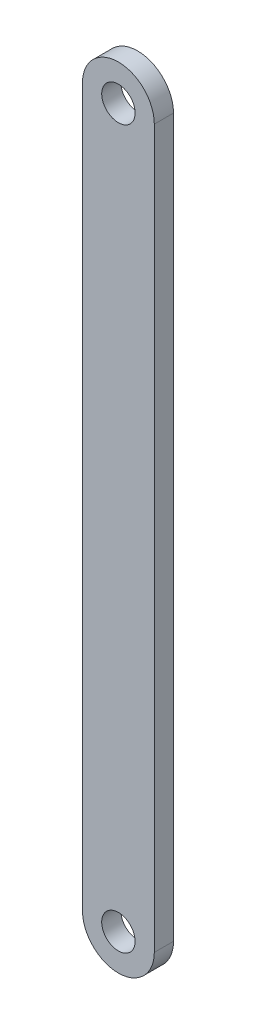
ISO-10303-21;
HEADER;
FILE_DESCRIPTION(('STEP AP214'),'2;1');
FILE_NAME('part.step','',(''),(''),'','','');
FILE_SCHEMA(('AUTOMOTIVE_DESIGN { 1 0 10303 214 1 1 1 1 }'));
ENDSEC;
DATA;
#1=APPLICATION_CONTEXT('core data for automotive mechanical design processes');
#2=APPLICATION_PROTOCOL_DEFINITION('international standard','automotive_design',2000,#1);
#3=PRODUCT_CONTEXT('',#1,'mechanical');
#4=PRODUCT('Part','Part','',(#3));
#5=PRODUCT_RELATED_PRODUCT_CATEGORY('part','',(#4));
#6=PRODUCT_DEFINITION_FORMATION('','',#4);
#7=PRODUCT_DEFINITION_CONTEXT('part definition',#1,'design');
#8=PRODUCT_DEFINITION('design','',#6,#7);
#9=PRODUCT_DEFINITION_SHAPE('','',#8);
#10=(LENGTH_UNIT() NAMED_UNIT(*) SI_UNIT(.MILLI.,.METRE.));
#11=(NAMED_UNIT(*) PLANE_ANGLE_UNIT() SI_UNIT($,.RADIAN.));
#12=(NAMED_UNIT(*) SI_UNIT($,.STERADIAN.) SOLID_ANGLE_UNIT());
#13=UNCERTAINTY_MEASURE_WITH_UNIT(LENGTH_MEASURE(1.E-05),#10,'distance_accuracy_value','');
#14=(GEOMETRIC_REPRESENTATION_CONTEXT(3) GLOBAL_UNCERTAINTY_ASSIGNED_CONTEXT((#13)) GLOBAL_UNIT_ASSIGNED_CONTEXT((#10,
#11,#12)) REPRESENTATION_CONTEXT('',''));
#15=CARTESIAN_POINT('',(0.,0.,0.));
#16=DIRECTION('',(0.,0.,1.));
#17=DIRECTION('',(1.,0.,0.));
#18=AXIS2_PLACEMENT_3D('',#15,#16,#17);
#19=CARTESIAN_POINT('',(0.,0.,5.));
#20=DIRECTION('',(0.,0.,1.));
#21=DIRECTION('',(1.,0.,0.));
#22=AXIS2_PLACEMENT_3D('',#19,#20,#21);
#23=PLANE('',#22);
#24=CARTESIAN_POINT('',(0.,0.,5.));
#25=DIRECTION('',(0.,0.,1.));
#26=DIRECTION('',(1.,0.,0.));
#27=AXIS2_PLACEMENT_3D('',#24,#25,#26);
#28=CIRCLE('',#27,4.35);
#29=CARTESIAN_POINT('',(4.35,0.,5.));
#30=VERTEX_POINT('',#29);
#31=EDGE_CURVE('E112',#30,#30,#28,.T.);
#32=ORIENTED_EDGE('',*,*,#31,.F.);
#33=EDGE_LOOP('',(#32));
#34=FACE_BOUND('',#33,.T.);
#35=CARTESIAN_POINT('',(0.,0.,5.));
#36=DIRECTION('',(0.,0.,1.));
#37=DIRECTION('',(1.,0.,0.));
#38=AXIS2_PLACEMENT_3D('',#35,#36,#37);
#39=CIRCLE('',#38,9.35);
#40=CARTESIAN_POINT('',(-9.35,0.,5.));
#41=VERTEX_POINT('',#40);
#42=CARTESIAN_POINT('',(9.35,0.,5.));
#43=VERTEX_POINT('',#42);
#44=EDGE_CURVE('E92',#41,#43,#39,.T.);
#45=ORIENTED_EDGE('',*,*,#44,.T.);
#46=DIRECTION('',(0.,1.,0.));
#47=VECTOR('',#46,1.);
#48=CARTESIAN_POINT('',(9.35,0.,5.));
#49=LINE('',#48,#47);
#50=CARTESIAN_POINT('',(9.35,186.85,5.));
#51=VERTEX_POINT('',#50);
#52=EDGE_CURVE('E87',#43,#51,#49,.T.);
#53=ORIENTED_EDGE('',*,*,#52,.T.);
#54=CARTESIAN_POINT('',(0.,186.85,5.));
#55=DIRECTION('',(0.,0.,1.));
#56=DIRECTION('',(1.,0.,0.));
#57=AXIS2_PLACEMENT_3D('',#54,#55,#56);
#58=CIRCLE('',#57,9.35);
#59=CARTESIAN_POINT('',(-9.35,186.85,5.));
#60=VERTEX_POINT('',#59);
#61=EDGE_CURVE('E90',#51,#60,#58,.T.);
#62=ORIENTED_EDGE('',*,*,#61,.T.);
#63=DIRECTION('',(0.,-1.,0.));
#64=VECTOR('',#63,1.);
#65=CARTESIAN_POINT('',(-9.35,0.,5.));
#66=LINE('',#65,#64);
#67=EDGE_CURVE('E57',#60,#41,#66,.T.);
#68=ORIENTED_EDGE('',*,*,#67,.T.);
#69=EDGE_LOOP('',(#45,#53,#62,#68));
#70=FACE_BOUND('',#69,.T.);
#71=CARTESIAN_POINT('',(0.,186.85,5.));
#72=DIRECTION('',(0.,0.,1.));
#73=DIRECTION('',(1.,0.,0.));
#74=AXIS2_PLACEMENT_3D('',#71,#72,#73);
#75=CIRCLE('',#74,4.35);
#76=CARTESIAN_POINT('',(4.35,186.85,5.));
#77=VERTEX_POINT('',#76);
#78=EDGE_CURVE('E134',#77,#77,#75,.T.);
#79=ORIENTED_EDGE('',*,*,#78,.F.);
#80=EDGE_LOOP('',(#79));
#81=FACE_BOUND('',#80,.T.);
#82=ADVANCED_FACE('F39',(#34,#70,#81),#23,.T.);
#83=CARTESIAN_POINT('',(0.,0.,0.));
#84=DIRECTION('',(0.,0.,1.));
#85=DIRECTION('',(1.,0.,0.));
#86=AXIS2_PLACEMENT_3D('',#83,#84,#85);
#87=PLANE('',#86);
#88=CARTESIAN_POINT('',(0.,0.,0.));
#89=DIRECTION('',(0.,0.,1.));
#90=DIRECTION('',(1.,0.,0.));
#91=AXIS2_PLACEMENT_3D('',#88,#89,#90);
#92=CIRCLE('',#91,9.35);
#93=CARTESIAN_POINT('',(-9.35,0.,0.));
#94=VERTEX_POINT('',#93);
#95=CARTESIAN_POINT('',(9.35,0.,0.));
#96=VERTEX_POINT('',#95);
#97=EDGE_CURVE('E108',#94,#96,#92,.T.);
#98=ORIENTED_EDGE('',*,*,#97,.F.);
#99=DIRECTION('',(0.,-1.,0.));
#100=VECTOR('',#99,1.);
#101=CARTESIAN_POINT('',(-9.35,0.,0.));
#102=LINE('',#101,#100);
#103=CARTESIAN_POINT('',(-9.35,186.85,0.));
#104=VERTEX_POINT('',#103);
#105=EDGE_CURVE('E80',#104,#94,#102,.T.);
#106=ORIENTED_EDGE('',*,*,#105,.F.);
#107=CARTESIAN_POINT('',(0.,186.85,0.));
#108=DIRECTION('',(0.,0.,1.));
#109=DIRECTION('',(1.,0.,0.));
#110=AXIS2_PLACEMENT_3D('',#107,#108,#109);
#111=CIRCLE('',#110,9.35);
#112=CARTESIAN_POINT('',(9.35,186.85,0.));
#113=VERTEX_POINT('',#112);
#114=EDGE_CURVE('E74',#113,#104,#111,.T.);
#115=ORIENTED_EDGE('',*,*,#114,.F.);
#116=DIRECTION('',(0.,1.,0.));
#117=VECTOR('',#116,1.);
#118=CARTESIAN_POINT('',(9.35,0.,0.));
#119=LINE('',#118,#117);
#120=EDGE_CURVE('E97',#96,#113,#119,.T.);
#121=ORIENTED_EDGE('',*,*,#120,.F.);
#122=EDGE_LOOP('',(#98,#106,#115,#121));
#123=FACE_BOUND('',#122,.T.);
#124=CARTESIAN_POINT('',(0.,0.,0.));
#125=DIRECTION('',(0.,0.,1.));
#126=DIRECTION('',(1.,0.,0.));
#127=AXIS2_PLACEMENT_3D('',#124,#125,#126);
#128=CIRCLE('',#127,4.35);
#129=CARTESIAN_POINT('',(4.35,0.,0.));
#130=VERTEX_POINT('',#129);
#131=EDGE_CURVE('E130',#130,#130,#128,.T.);
#132=ORIENTED_EDGE('',*,*,#131,.T.);
#133=EDGE_LOOP('',(#132));
#134=FACE_BOUND('',#133,.T.);
#135=CARTESIAN_POINT('',(0.,186.85,0.));
#136=DIRECTION('',(0.,0.,1.));
#137=DIRECTION('',(1.,0.,0.));
#138=AXIS2_PLACEMENT_3D('',#135,#136,#137);
#139=CIRCLE('',#138,4.35);
#140=CARTESIAN_POINT('',(4.35,186.85,0.));
#141=VERTEX_POINT('',#140);
#142=EDGE_CURVE('E138',#141,#141,#139,.T.);
#143=ORIENTED_EDGE('',*,*,#142,.T.);
#144=EDGE_LOOP('',(#143));
#145=FACE_BOUND('',#144,.T.);
#146=ADVANCED_FACE('F125',(#123,#134,#145),#87,.F.);
#147=CARTESIAN_POINT('',(0.,0.,5.));
#148=DIRECTION('',(0.,0.,-1.));
#149=DIRECTION('',(-1.,0.,0.));
#150=AXIS2_PLACEMENT_3D('',#147,#148,#149);
#151=CYLINDRICAL_SURFACE('',#150,9.35);
#152=ORIENTED_EDGE('',*,*,#97,.T.);
#153=DIRECTION('',(0.,0.,-1.));
#154=VECTOR('',#153,1.);
#155=CARTESIAN_POINT('',(9.35,0.,5.));
#156=LINE('',#155,#154);
#157=EDGE_CURVE('E11',#43,#96,#156,.T.);
#158=ORIENTED_EDGE('',*,*,#157,.F.);
#159=ORIENTED_EDGE('',*,*,#44,.F.);
#160=DIRECTION('',(0.,0.,-1.));
#161=VECTOR('',#160,1.);
#162=CARTESIAN_POINT('',(-9.35,0.,5.));
#163=LINE('',#162,#161);
#164=EDGE_CURVE('E104',#41,#94,#163,.T.);
#165=ORIENTED_EDGE('',*,*,#164,.T.);
#166=EDGE_LOOP('',(#152,#158,#159,#165));
#167=FACE_BOUND('',#166,.T.);
#168=ADVANCED_FACE('F41',(#167),#151,.T.);
#169=CARTESIAN_POINT('',(9.35,0.,5.));
#170=DIRECTION('',(-1.,0.,0.));
#171=DIRECTION('',(0.,0.,1.));
#172=AXIS2_PLACEMENT_3D('',#169,#170,#171);
#173=PLANE('',#172);
#174=ORIENTED_EDGE('',*,*,#120,.T.);
#175=DIRECTION('',(0.,0.,-1.));
#176=VECTOR('',#175,1.);
#177=CARTESIAN_POINT('',(9.35,186.85,5.));
#178=LINE('',#177,#176);
#179=EDGE_CURVE('E49',#51,#113,#178,.T.);
#180=ORIENTED_EDGE('',*,*,#179,.F.);
#181=ORIENTED_EDGE('',*,*,#52,.F.);
#182=ORIENTED_EDGE('',*,*,#157,.T.);
#183=EDGE_LOOP('',(#174,#180,#181,#182));
#184=FACE_BOUND('',#183,.T.);
#185=ADVANCED_FACE('F96',(#184),#173,.F.);
#186=CARTESIAN_POINT('',(0.,186.85,5.));
#187=DIRECTION('',(0.,0.,-1.));
#188=DIRECTION('',(-1.,0.,0.));
#189=AXIS2_PLACEMENT_3D('',#186,#187,#188);
#190=CYLINDRICAL_SURFACE('',#189,9.35);
#191=ORIENTED_EDGE('',*,*,#114,.T.);
#192=DIRECTION('',(0.,0.,-1.));
#193=VECTOR('',#192,1.);
#194=CARTESIAN_POINT('',(-9.35,186.85,5.));
#195=LINE('',#194,#193);
#196=EDGE_CURVE('E99',#60,#104,#195,.T.);
#197=ORIENTED_EDGE('',*,*,#196,.F.);
#198=ORIENTED_EDGE('',*,*,#61,.F.);
#199=ORIENTED_EDGE('',*,*,#179,.T.);
#200=EDGE_LOOP('',(#191,#197,#198,#199));
#201=FACE_BOUND('',#200,.T.);
#202=ADVANCED_FACE('F100',(#201),#190,.T.);
#203=CARTESIAN_POINT('',(-9.35,0.,5.));
#204=DIRECTION('',(1.,0.,0.));
#205=DIRECTION('',(0.,0.,-1.));
#206=AXIS2_PLACEMENT_3D('',#203,#204,#205);
#207=PLANE('',#206);
#208=ORIENTED_EDGE('',*,*,#105,.T.);
#209=ORIENTED_EDGE('',*,*,#164,.F.);
#210=ORIENTED_EDGE('',*,*,#67,.F.);
#211=ORIENTED_EDGE('',*,*,#196,.T.);
#212=EDGE_LOOP('',(#208,#209,#210,#211));
#213=FACE_BOUND('',#212,.T.);
#214=ADVANCED_FACE('F122',(#213),#207,.F.);
#215=CARTESIAN_POINT('',(0.,0.,5.));
#216=DIRECTION('',(0.,0.,-1.));
#217=DIRECTION('',(-1.,0.,0.));
#218=AXIS2_PLACEMENT_3D('',#215,#216,#217);
#219=CYLINDRICAL_SURFACE('',#218,4.35);
#220=ORIENTED_EDGE('',*,*,#31,.T.);
#221=EDGE_LOOP('',(#220));
#222=FACE_BOUND('',#221,.T.);
#223=ORIENTED_EDGE('',*,*,#131,.F.);
#224=EDGE_LOOP('',(#223));
#225=FACE_BOUND('',#224,.T.);
#226=ADVANCED_FACE('F157',(#222,#225),#219,.F.);
#227=CARTESIAN_POINT('',(0.,186.85,5.));
#228=DIRECTION('',(0.,0.,-1.));
#229=DIRECTION('',(-1.,0.,0.));
#230=AXIS2_PLACEMENT_3D('',#227,#228,#229);
#231=CYLINDRICAL_SURFACE('',#230,4.35);
#232=ORIENTED_EDGE('',*,*,#78,.T.);
#233=EDGE_LOOP('',(#232));
#234=FACE_BOUND('',#233,.T.);
#235=ORIENTED_EDGE('',*,*,#142,.F.);
#236=EDGE_LOOP('',(#235));
#237=FACE_BOUND('',#236,.T.);
#238=ADVANCED_FACE('F146',(#234,#237),#231,.F.);
#239=CLOSED_SHELL('',(#82,#146,#168,#185,#202,#214,#226,#238));
#240=MANIFOLD_SOLID_BREP('B2',#239);
#241=ADVANCED_BREP_SHAPE_REPRESENTATION('',(#18,#240),#14);
#242=SHAPE_DEFINITION_REPRESENTATION(#9,#241);
ENDSEC;
END-ISO-10303-21;
